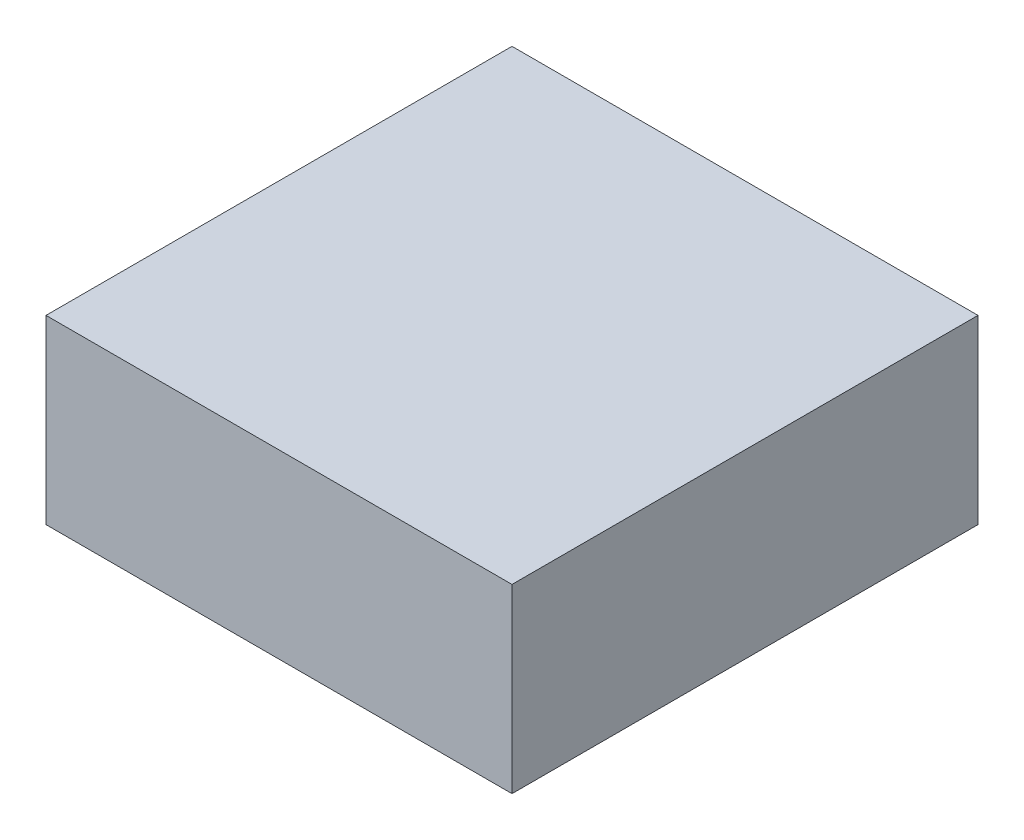
ISO-10303-21;
HEADER;
FILE_DESCRIPTION(('STEP AP214'),'2;1');
FILE_NAME('part.step','',(''),(''),'','','');
FILE_SCHEMA(('AUTOMOTIVE_DESIGN { 1 0 10303 214 1 1 1 1 }'));
ENDSEC;
DATA;
#1=APPLICATION_CONTEXT('core data for automotive mechanical design processes');
#2=APPLICATION_PROTOCOL_DEFINITION('international standard','automotive_design',2000,#1);
#3=PRODUCT_CONTEXT('',#1,'mechanical');
#4=PRODUCT('Part','Part','',(#3));
#5=PRODUCT_RELATED_PRODUCT_CATEGORY('part','',(#4));
#6=PRODUCT_DEFINITION_FORMATION('','',#4);
#7=PRODUCT_DEFINITION_CONTEXT('part definition',#1,'design');
#8=PRODUCT_DEFINITION('design','',#6,#7);
#9=PRODUCT_DEFINITION_SHAPE('','',#8);
#10=(LENGTH_UNIT() NAMED_UNIT(*) SI_UNIT(.MILLI.,.METRE.));
#11=(NAMED_UNIT(*) PLANE_ANGLE_UNIT() SI_UNIT($,.RADIAN.));
#12=(NAMED_UNIT(*) SI_UNIT($,.STERADIAN.) SOLID_ANGLE_UNIT());
#13=UNCERTAINTY_MEASURE_WITH_UNIT(LENGTH_MEASURE(1.E-05),#10,'distance_accuracy_value','');
#14=(GEOMETRIC_REPRESENTATION_CONTEXT(3) GLOBAL_UNCERTAINTY_ASSIGNED_CONTEXT((#13)) GLOBAL_UNIT_ASSIGNED_CONTEXT((#10,
#11,#12)) REPRESENTATION_CONTEXT('',''));
#15=CARTESIAN_POINT('',(0.,0.,0.));
#16=DIRECTION('',(0.,0.,1.));
#17=DIRECTION('',(1.,0.,0.));
#18=AXIS2_PLACEMENT_3D('',#15,#16,#17);
#19=CARTESIAN_POINT('',(0.90000074,0.3499993,1.79999894));
#20=DIRECTION('',(0.,0.,-1.));
#21=DIRECTION('',(0.,-1.,0.));
#22=AXIS2_PLACEMENT_3D('',#19,#20,#21);
#23=PLANE('',#22);
#24=DIRECTION('',(-1.,0.,0.));
#25=VECTOR('',#24,1.);
#26=CARTESIAN_POINT('',(0.90000074,0.3499993,1.79999894));
#27=LINE('',#26,#25);
#28=CARTESIAN_POINT('',(0.90000074,0.3499993,1.79999894));
#29=VERTEX_POINT('',#28);
#30=CARTESIAN_POINT('',(-0.8999982,0.3499993,1.79999894));
#31=VERTEX_POINT('',#30);
#32=EDGE_CURVE('E84',#29,#31,#27,.T.);
#33=ORIENTED_EDGE('',*,*,#32,.T.);
#34=DIRECTION('',(0.,-1.,0.));
#35=VECTOR('',#34,1.);
#36=CARTESIAN_POINT('',(-0.8999982,0.3499993,1.79999894));
#37=LINE('',#36,#35);
#38=CARTESIAN_POINT('',(-0.8999982,-0.3499993,1.79999894));
#39=VERTEX_POINT('',#38);
#40=EDGE_CURVE('E107',#31,#39,#37,.T.);
#41=ORIENTED_EDGE('',*,*,#40,.T.);
#42=DIRECTION('',(1.,0.,0.));
#43=VECTOR('',#42,1.);
#44=CARTESIAN_POINT('',(-0.8999982,-0.3499993,1.79999894));
#45=LINE('',#44,#43);
#46=CARTESIAN_POINT('',(0.90000074,-0.3499993,1.79999894));
#47=VERTEX_POINT('',#46);
#48=EDGE_CURVE('E20',#39,#47,#45,.T.);
#49=ORIENTED_EDGE('',*,*,#48,.T.);
#50=DIRECTION('',(0.,1.,0.));
#51=VECTOR('',#50,1.);
#52=CARTESIAN_POINT('',(0.90000074,-0.3499993,1.79999894));
#53=LINE('',#52,#51);
#54=EDGE_CURVE('E11',#47,#29,#53,.T.);
#55=ORIENTED_EDGE('',*,*,#54,.T.);
#56=EDGE_LOOP('',(#33,#41,#49,#55));
#57=FACE_BOUND('',#56,.T.);
#58=ADVANCED_FACE('F16',(#57),#23,.F.);
#59=CARTESIAN_POINT('',(0.90000074,0.3499993,0.));
#60=DIRECTION('',(0.,0.,-1.));
#61=DIRECTION('',(0.,-1.,0.));
#62=AXIS2_PLACEMENT_3D('',#59,#60,#61);
#63=PLANE('',#62);
#64=DIRECTION('',(0.,1.,0.));
#65=VECTOR('',#64,1.);
#66=CARTESIAN_POINT('',(0.90000074,-0.3499993,0.));
#67=LINE('',#66,#65);
#68=CARTESIAN_POINT('',(0.90000074,-0.3499993,0.));
#69=VERTEX_POINT('',#68);
#70=CARTESIAN_POINT('',(0.90000074,0.3499993,0.));
#71=VERTEX_POINT('',#70);
#72=EDGE_CURVE('E27',#69,#71,#67,.T.);
#73=ORIENTED_EDGE('',*,*,#72,.F.);
#74=DIRECTION('',(1.,0.,0.));
#75=VECTOR('',#74,1.);
#76=CARTESIAN_POINT('',(-0.8999982,-0.3499993,0.));
#77=LINE('',#76,#75);
#78=CARTESIAN_POINT('',(-0.8999982,-0.3499993,0.));
#79=VERTEX_POINT('',#78);
#80=EDGE_CURVE('E57',#79,#69,#77,.T.);
#81=ORIENTED_EDGE('',*,*,#80,.F.);
#82=DIRECTION('',(0.,-1.,0.));
#83=VECTOR('',#82,1.);
#84=CARTESIAN_POINT('',(-0.8999982,0.3499993,0.));
#85=LINE('',#84,#83);
#86=CARTESIAN_POINT('',(-0.8999982,0.3499993,0.));
#87=VERTEX_POINT('',#86);
#88=EDGE_CURVE('E86',#87,#79,#85,.T.);
#89=ORIENTED_EDGE('',*,*,#88,.F.);
#90=DIRECTION('',(-1.,0.,0.));
#91=VECTOR('',#90,1.);
#92=CARTESIAN_POINT('',(0.90000074,0.3499993,0.));
#93=LINE('',#92,#91);
#94=EDGE_CURVE('E83',#71,#87,#93,.T.);
#95=ORIENTED_EDGE('',*,*,#94,.F.);
#96=EDGE_LOOP('',(#73,#81,#89,#95));
#97=FACE_BOUND('',#96,.T.);
#98=ADVANCED_FACE('F88',(#97),#63,.T.);
#99=CARTESIAN_POINT('',(0.90000074,-0.3499993,0.));
#100=DIRECTION('',(-1.,0.,0.));
#101=DIRECTION('',(0.,0.,1.));
#102=AXIS2_PLACEMENT_3D('',#99,#100,#101);
#103=PLANE('',#102);
#104=ORIENTED_EDGE('',*,*,#72,.T.);
#105=DIRECTION('',(0.,0.,1.));
#106=VECTOR('',#105,1.);
#107=CARTESIAN_POINT('',(0.90000074,0.3499993,0.));
#108=LINE('',#107,#106);
#109=EDGE_CURVE('E72',#71,#29,#108,.T.);
#110=ORIENTED_EDGE('',*,*,#109,.T.);
#111=ORIENTED_EDGE('',*,*,#54,.F.);
#112=DIRECTION('',(0.,0.,1.));
#113=VECTOR('',#112,1.);
#114=CARTESIAN_POINT('',(0.90000074,-0.3499993,0.));
#115=LINE('',#114,#113);
#116=EDGE_CURVE('E75',#69,#47,#115,.T.);
#117=ORIENTED_EDGE('',*,*,#116,.F.);
#118=EDGE_LOOP('',(#104,#110,#111,#117));
#119=FACE_BOUND('',#118,.T.);
#120=ADVANCED_FACE('F18',(#119),#103,.F.);
#121=CARTESIAN_POINT('',(-0.8999982,-0.3499993,0.));
#122=DIRECTION('',(0.,1.,0.));
#123=DIRECTION('',(1.,0.,0.));
#124=AXIS2_PLACEMENT_3D('',#121,#122,#123);
#125=PLANE('',#124);
#126=ORIENTED_EDGE('',*,*,#80,.T.);
#127=ORIENTED_EDGE('',*,*,#116,.T.);
#128=ORIENTED_EDGE('',*,*,#48,.F.);
#129=DIRECTION('',(0.,0.,1.));
#130=VECTOR('',#129,1.);
#131=CARTESIAN_POINT('',(-0.8999982,-0.3499993,0.));
#132=LINE('',#131,#130);
#133=EDGE_CURVE('E101',#79,#39,#132,.T.);
#134=ORIENTED_EDGE('',*,*,#133,.F.);
#135=EDGE_LOOP('',(#126,#127,#128,#134));
#136=FACE_BOUND('',#135,.T.);
#137=ADVANCED_FACE('F119',(#136),#125,.F.);
#138=CARTESIAN_POINT('',(-0.8999982,0.3499993,0.));
#139=DIRECTION('',(1.,0.,0.));
#140=DIRECTION('',(0.,1.,0.));
#141=AXIS2_PLACEMENT_3D('',#138,#139,#140);
#142=PLANE('',#141);
#143=ORIENTED_EDGE('',*,*,#88,.T.);
#144=ORIENTED_EDGE('',*,*,#133,.T.);
#145=ORIENTED_EDGE('',*,*,#40,.F.);
#146=DIRECTION('',(0.,0.,1.));
#147=VECTOR('',#146,1.);
#148=CARTESIAN_POINT('',(-0.8999982,0.3499993,0.));
#149=LINE('',#148,#147);
#150=EDGE_CURVE('E92',#87,#31,#149,.T.);
#151=ORIENTED_EDGE('',*,*,#150,.F.);
#152=EDGE_LOOP('',(#143,#144,#145,#151));
#153=FACE_BOUND('',#152,.T.);
#154=ADVANCED_FACE('F117',(#153),#142,.F.);
#155=CARTESIAN_POINT('',(0.90000074,0.3499993,0.));
#156=DIRECTION('',(0.,-1.,0.));
#157=DIRECTION('',(0.,0.,-1.));
#158=AXIS2_PLACEMENT_3D('',#155,#156,#157);
#159=PLANE('',#158);
#160=ORIENTED_EDGE('',*,*,#94,.T.);
#161=ORIENTED_EDGE('',*,*,#150,.T.);
#162=ORIENTED_EDGE('',*,*,#32,.F.);
#163=ORIENTED_EDGE('',*,*,#109,.F.);
#164=EDGE_LOOP('',(#160,#161,#162,#163));
#165=FACE_BOUND('',#164,.T.);
#166=ADVANCED_FACE('F81',(#165),#159,.F.);
#167=CLOSED_SHELL('',(#58,#98,#120,#137,#154,#166));
#168=MANIFOLD_SOLID_BREP('B1',#167);
#169=ADVANCED_BREP_SHAPE_REPRESENTATION('',(#18,#168),#14);
#170=SHAPE_DEFINITION_REPRESENTATION(#9,#169);
ENDSEC;
END-ISO-10303-21;
